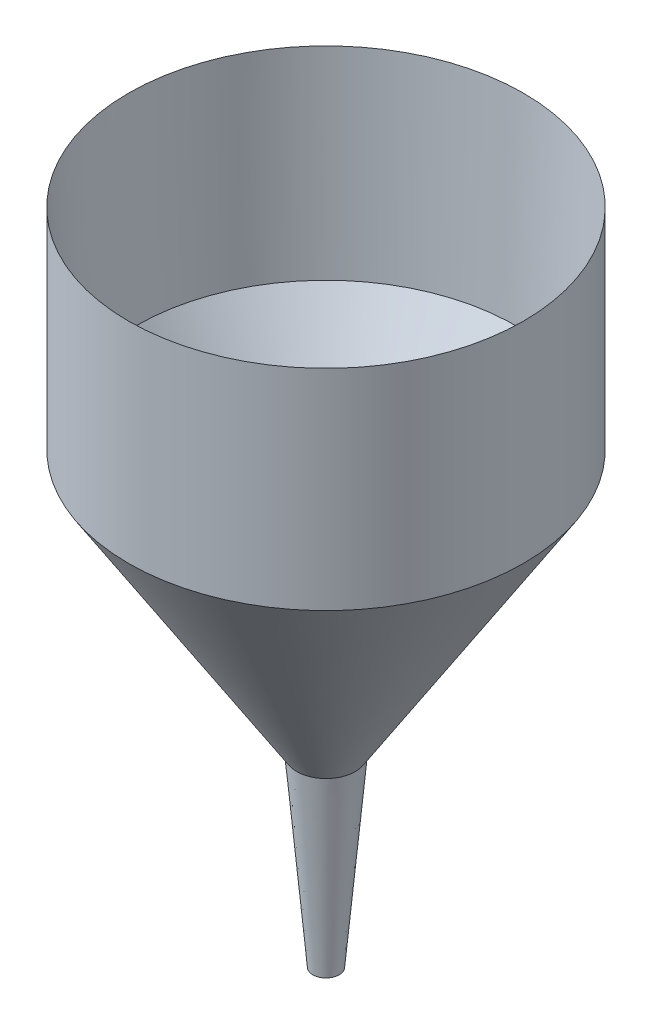
ISO-10303-21;
HEADER;
FILE_DESCRIPTION(('STEP AP214'),'2;1');
FILE_NAME('part.step','',(''),(''),'','','');
FILE_SCHEMA(('AUTOMOTIVE_DESIGN { 1 0 10303 214 1 1 1 1 }'));
ENDSEC;
DATA;
#1=APPLICATION_CONTEXT('core data for automotive mechanical design processes');
#2=APPLICATION_PROTOCOL_DEFINITION('international standard','automotive_design',2000,#1);
#3=PRODUCT_CONTEXT('',#1,'mechanical');
#4=PRODUCT('Part','Part','',(#3));
#5=PRODUCT_RELATED_PRODUCT_CATEGORY('part','',(#4));
#6=PRODUCT_DEFINITION_FORMATION('','',#4);
#7=PRODUCT_DEFINITION_CONTEXT('part definition',#1,'design');
#8=PRODUCT_DEFINITION('design','',#6,#7);
#9=PRODUCT_DEFINITION_SHAPE('','',#8);
#10=(LENGTH_UNIT() NAMED_UNIT(*) SI_UNIT(.MILLI.,.METRE.));
#11=(NAMED_UNIT(*) PLANE_ANGLE_UNIT() SI_UNIT($,.RADIAN.));
#12=(NAMED_UNIT(*) SI_UNIT($,.STERADIAN.) SOLID_ANGLE_UNIT());
#13=UNCERTAINTY_MEASURE_WITH_UNIT(LENGTH_MEASURE(1.E-05),#10,'distance_accuracy_value','');
#14=(GEOMETRIC_REPRESENTATION_CONTEXT(3) GLOBAL_UNCERTAINTY_ASSIGNED_CONTEXT((#13)) GLOBAL_UNIT_ASSIGNED_CONTEXT((#10,
#11,#12)) REPRESENTATION_CONTEXT('',''));
#15=CARTESIAN_POINT('',(0.,0.,0.));
#16=DIRECTION('',(0.,0.,1.));
#17=DIRECTION('',(1.,0.,0.));
#18=AXIS2_PLACEMENT_3D('',#15,#16,#17);
#19=CARTESIAN_POINT('',(0.,35.00020346889,0.));
#20=DIRECTION('',(0.,1.,0.));
#21=DIRECTION('',(-1.,0.,0.));
#22=AXIS2_PLACEMENT_3D('',#19,#20,#21);
#23=CONICAL_SURFACE('',#22,14.4106563891995,0.0392699081698657);
#24=CARTESIAN_POINT('',(0.,50.,0.));
#25=DIRECTION('',(0.,1.,0.));
#26=DIRECTION('',(-1.,0.,0.));
#27=AXIS2_PLACEMENT_3D('',#24,#25,#26);
#28=CIRCLE('',#27,15.);
#29=CARTESIAN_POINT('',(-15.,50.,0.));
#30=VERTEX_POINT('',#29);
#31=EDGE_CURVE('E53',#30,#30,#28,.T.);
#32=ORIENTED_EDGE('',*,*,#31,.T.);
#33=EDGE_LOOP('',(#32));
#34=FACE_BOUND('',#33,.T.);
#35=CARTESIAN_POINT('',(0.,35.00020346889,0.));
#36=DIRECTION('',(0.,1.,0.));
#37=DIRECTION('',(-1.,0.,0.));
#38=AXIS2_PLACEMENT_3D('',#35,#36,#37);
#39=CIRCLE('',#38,14.4106563891995);
#40=CARTESIAN_POINT('',(-14.4106563891995,35.00020346889,0.));
#41=VERTEX_POINT('',#40);
#42=EDGE_CURVE('E10',#41,#41,#39,.T.);
#43=ORIENTED_EDGE('',*,*,#42,.F.);
#44=EDGE_LOOP('',(#43));
#45=FACE_BOUND('',#44,.T.);
#46=ADVANCED_FACE('F31',(#34,#45),#23,.F.);
#47=CARTESIAN_POINT('',(0.,13.9218570853772,0.));
#48=DIRECTION('',(0.,1.,0.));
#49=DIRECTION('',(-1.,0.,0.));
#50=AXIS2_PLACEMENT_3D('',#47,#48,#49);
#51=CONICAL_SURFACE('',#50,0.999999999999994,0.566633421036452);
#52=CARTESIAN_POINT('',(0.,13.9218570853772,0.));
#53=DIRECTION('',(0.,1.,0.));
#54=DIRECTION('',(-1.,0.,0.));
#55=AXIS2_PLACEMENT_3D('',#52,#53,#54);
#56=CIRCLE('',#55,0.999999999999994);
#57=CARTESIAN_POINT('',(-0.999999999999993,13.9218570853772,0.));
#58=VERTEX_POINT('',#57);
#59=EDGE_CURVE('E37',#58,#58,#56,.T.);
#60=CARTESIAN_POINT('',(-14.4106563891995,35.00020346889,0.));
#61=CARTESIAN_POINT('',(-14.270962051812,34.7806373607284,0.));
#62=CARTESIAN_POINT('',(-14.1312677144245,34.5610712525669,0.));
#63=CARTESIAN_POINT('',(-13.8518790396495,34.1219390362437,0.));
#64=CARTESIAN_POINT('',(-13.712184702262,33.9023729280821,0.));
#65=CARTESIAN_POINT('',(-13.432796027487,33.4632407117589,0.));
#66=CARTESIAN_POINT('',(-13.2931016900996,33.2436746035973,0.));
#67=CARTESIAN_POINT('',(-13.0137130153246,32.8045423872741,0.));
#68=CARTESIAN_POINT('',(-12.8740186779371,32.5849762791125,0.));
#69=CARTESIAN_POINT('',(-12.5946300031621,32.1458440627893,0.));
#70=CARTESIAN_POINT('',(-12.4549356657746,31.9262779546278,0.));
#71=CARTESIAN_POINT('',(-12.1755469909996,31.4871457383046,0.));
#72=CARTESIAN_POINT('',(-12.0358526536121,31.267579630143,0.));
#73=CARTESIAN_POINT('',(-11.7564639788371,30.8284474138198,0.));
#74=CARTESIAN_POINT('',(-11.6167696414496,30.6088813056582,0.));
#75=CARTESIAN_POINT('',(-11.3373809666746,30.169749089335,0.));
#76=CARTESIAN_POINT('',(-11.1976866292871,29.9501829811734,0.));
#77=CARTESIAN_POINT('',(-10.9182979545121,29.5110507648502,0.));
#78=CARTESIAN_POINT('',(-10.7786036171246,29.2914846566887,0.));
#79=CARTESIAN_POINT('',(-10.4992149423497,28.8523524403655,0.));
#80=CARTESIAN_POINT('',(-10.3595206049622,28.6327863322039,0.));
#81=CARTESIAN_POINT('',(-10.0801319301872,28.1936541158807,0.));
#82=CARTESIAN_POINT('',(-9.94043759279968,27.9740880077191,0.));
#83=CARTESIAN_POINT('',(-9.66104891802469,27.5349557913959,0.));
#84=CARTESIAN_POINT('',(-9.52135458063719,27.3153896832343,0.));
#85=CARTESIAN_POINT('',(-9.2419659058622,26.8762574669111,0.));
#86=CARTESIAN_POINT('',(-9.10227156847471,26.6566913587496,0.));
#87=CARTESIAN_POINT('',(-8.82288289369972,26.2175591424264,0.));
#88=CARTESIAN_POINT('',(-8.68318855631222,25.9979930342648,0.));
#89=CARTESIAN_POINT('',(-8.40379988153723,25.5588608179416,0.));
#90=CARTESIAN_POINT('',(-8.26410554414973,25.33929470978,0.));
#91=CARTESIAN_POINT('',(-7.98471686937475,24.9001624934568,0.));
#92=CARTESIAN_POINT('',(-7.84502253198725,24.6805963852952,0.));
#93=CARTESIAN_POINT('',(-7.56563385721226,24.241464168972,0.));
#94=CARTESIAN_POINT('',(-7.42593951982476,24.0218980608105,0.));
#95=CARTESIAN_POINT('',(-7.14655084504977,23.5827658444873,0.));
#96=CARTESIAN_POINT('',(-7.00685650766228,23.3631997363257,0.));
#97=CARTESIAN_POINT('',(-6.72746783288729,22.9240675200025,0.));
#98=CARTESIAN_POINT('',(-6.58777349549979,22.7045014118409,0.));
#99=CARTESIAN_POINT('',(-6.3083848207248,22.2653691955177,0.));
#100=CARTESIAN_POINT('',(-6.16869048333731,22.0458030873561,0.));
#101=CARTESIAN_POINT('',(-5.88930180856232,21.606670871033,0.));
#102=CARTESIAN_POINT('',(-5.74960747117483,21.3871047628714,0.));
#103=CARTESIAN_POINT('',(-5.47021879639984,20.9479725465482,0.));
#104=CARTESIAN_POINT('',(-5.33052445901234,20.7284064383866,0.));
#105=CARTESIAN_POINT('',(-5.05113578423735,20.2892742220634,0.));
#106=CARTESIAN_POINT('',(-4.91144144684986,20.0697081139018,0.));
#107=CARTESIAN_POINT('',(-4.63205277207487,19.6305758975786,0.));
#108=CARTESIAN_POINT('',(-4.49235843468737,19.411009789417,0.));
#109=CARTESIAN_POINT('',(-4.21296975991238,18.9718775730939,0.));
#110=CARTESIAN_POINT('',(-4.07327542252489,18.7523114649323,0.));
#111=CARTESIAN_POINT('',(-3.7938867477499,18.3131792486091,0.));
#112=CARTESIAN_POINT('',(-3.6541924103624,18.0936131404475,0.));
#113=CARTESIAN_POINT('',(-3.37480373558741,17.6544809241243,0.));
#114=CARTESIAN_POINT('',(-3.23510939819992,17.4349148159627,0.));
#115=CARTESIAN_POINT('',(-2.95572072342492,16.9957825996395,0.));
#116=CARTESIAN_POINT('',(-2.81602638603743,16.7762164914779,0.));
#117=CARTESIAN_POINT('',(-2.53663771126244,16.3370842751548,0.));
#118=CARTESIAN_POINT('',(-2.39694337387494,16.1175181669932,0.));
#119=CARTESIAN_POINT('',(-2.11755469909995,15.67838595067,0.));
#120=CARTESIAN_POINT('',(-1.97786036171246,15.4588198425084,0.));
#121=CARTESIAN_POINT('',(-1.69847168693747,15.0196876261852,0.));
#122=CARTESIAN_POINT('',(-1.55877734954997,14.8001215180236,0.));
#123=CARTESIAN_POINT('',(-1.27938867477498,14.3609893017004,0.));
#124=CARTESIAN_POINT('',(-1.13969433738749,14.1414231935388,0.));
#125=CARTESIAN_POINT('',(-0.999999999999994,13.9218570853772,0.));
#126=B_SPLINE_CURVE_WITH_KNOTS('',3,(#60,#61,#62,#63,#64,#65,#66,#67,#68,#69,#70,#71,#72,#73,
#74,#75,#76,#77,#78,#79,#80,#81,#82,#83,#84,#85,#86,#87,#88,#89,#90,#91,#92,#93,#94,#95,#96,#97,
#98,#99,#100,#101,#102,#103,#104,#105,#106,#107,#108,#109,#110,#111,#112,#113,#114,#115,#116,
#117,#118,#119,#120,#121,#122,#123,#124,#125),.UNSPECIFIED.,.F.,.F.,(4,2,2,2,2,2,2,2,2,2,2,2,2,
2,2,2,2,2,2,2,2,2,2,2,2,2,2,2,2,2,2,2,4),(0.,0.780713810408293,1.56142762081658,
2.34214143122487,3.12285524163316,3.90356905204145,4.68428286244974,5.46499667285803,
6.24571048326632,7.02642429367461,7.8071381040829,8.58785191449119,9.36856572489948,
10.1492795353078,10.9299933457161,11.7107071561243,12.4914209665326,13.2721347769409,
14.0528485873492,14.8335623977575,15.6142762081658,16.3949900185741,17.1757038289824,
17.9564176393907,18.737131449799,19.5178452602072,20.2985590706155,21.0792728810238,
21.8599866914321,22.6407005018404,23.4214143122487,24.202128122657,24.9828419330653),.UNSPECIFIED.);
#127=EDGE_CURVE('BSEAM71',#41,#58,#126,.T.);
#128=ORIENTED_EDGE('',*,*,#42,.T.);
#129=ORIENTED_EDGE('',*,*,#59,.F.);
#130=ORIENTED_EDGE('',*,*,#127,.T.);
#131=ORIENTED_EDGE('',*,*,#127,.F.);
#132=EDGE_LOOP('',(#128,#130,#129,#131));
#133=FACE_BOUND('',#132,.T.);
#134=ADVANCED_FACE('F71',(#133),#51,.F.);
#135=CARTESIAN_POINT('',(0.,50.,0.));
#136=DIRECTION('',(0.,1.,0.));
#137=DIRECTION('',(-1.,0.,0.));
#138=AXIS2_PLACEMENT_3D('',#135,#136,#137);
#139=CYLINDRICAL_SURFACE('',#138,0.999999999999994);
#140=ORIENTED_EDGE('',*,*,#59,.T.);
#141=EDGE_LOOP('',(#140));
#142=FACE_BOUND('',#141,.T.);
#143=CARTESIAN_POINT('',(0.,0.,0.));
#144=DIRECTION('',(0.,1.,0.));
#145=DIRECTION('',(-1.,0.,0.));
#146=AXIS2_PLACEMENT_3D('',#143,#144,#145);
#147=CIRCLE('',#146,0.999999999999994);
#148=CARTESIAN_POINT('',(-0.999999999999994,0.,0.));
#149=VERTEX_POINT('',#148);
#150=EDGE_CURVE('E41',#149,#149,#147,.T.);
#151=ORIENTED_EDGE('',*,*,#150,.F.);
#152=EDGE_LOOP('',(#151));
#153=FACE_BOUND('',#152,.T.);
#154=ADVANCED_FACE('F75',(#142,#153),#139,.F.);
#155=CARTESIAN_POINT('',(0.,13.9815709150997,0.));
#156=DIRECTION('',(0.,1.,0.));
#157=DIRECTION('',(-1.,0.,0.));
#158=AXIS2_PLACEMENT_3D('',#155,#156,#157);
#159=CONICAL_SURFACE('',#158,2.22322895335491,0.0872664625997098);
#160=ORIENTED_EDGE('',*,*,#150,.T.);
#161=EDGE_LOOP('',(#160));
#162=FACE_BOUND('',#161,.T.);
#163=CARTESIAN_POINT('',(0.,13.9815709150997,0.));
#164=DIRECTION('',(0.,1.,0.));
#165=DIRECTION('',(-1.,0.,0.));
#166=AXIS2_PLACEMENT_3D('',#163,#164,#165);
#167=CIRCLE('',#166,2.22322895335491);
#168=CARTESIAN_POINT('',(-2.22322895335491,13.9815709150997,0.));
#169=VERTEX_POINT('',#168);
#170=EDGE_CURVE('E45',#169,#169,#167,.T.);
#171=ORIENTED_EDGE('',*,*,#170,.F.);
#172=EDGE_LOOP('',(#171));
#173=FACE_BOUND('',#172,.T.);
#174=ADVANCED_FACE('F67',(#162,#173),#159,.T.);
#175=CARTESIAN_POINT('',(0.,34.0636010535289,0.));
#176=DIRECTION('',(0.,1.,0.));
#177=DIRECTION('',(-1.,0.,0.));
#178=AXIS2_PLACEMENT_3D('',#175,#176,#177);
#179=CONICAL_SURFACE('',#178,15.,0.566633421036452);
#180=CARTESIAN_POINT('',(0.,34.0636010535289,0.));
#181=DIRECTION('',(0.,1.,0.));
#182=DIRECTION('',(-1.,0.,0.));
#183=AXIS2_PLACEMENT_3D('',#180,#181,#182);
#184=CIRCLE('',#183,15.);
#185=CARTESIAN_POINT('',(-15.,34.0636010535289,0.));
#186=VERTEX_POINT('',#185);
#187=EDGE_CURVE('E50',#186,#186,#184,.T.);
#188=CARTESIAN_POINT('',(-2.22322895335491,13.9815709150997,0.));
#189=CARTESIAN_POINT('',(-2.35632031842413,14.1907587290417,0.));
#190=CARTESIAN_POINT('',(-2.48941168349334,14.3999465429837,0.));
#191=CARTESIAN_POINT('',(-2.75559441363178,14.8183221708676,0.));
#192=CARTESIAN_POINT('',(-2.88868577870101,15.0275099848096,0.));
#193=CARTESIAN_POINT('',(-3.15486850883944,15.4458856126935,0.));
#194=CARTESIAN_POINT('',(-3.28795987390866,15.6550734266355,0.));
#195=CARTESIAN_POINT('',(-3.5541426040471,16.0734490545194,0.));
#196=CARTESIAN_POINT('',(-3.68723396911632,16.2826368684614,0.));
#197=CARTESIAN_POINT('',(-3.95341669925476,16.7010124963453,0.));
#198=CARTESIAN_POINT('',(-4.08650806432398,16.9102003102873,0.));
#199=CARTESIAN_POINT('',(-4.35269079446242,17.3285759381713,0.));
#200=CARTESIAN_POINT('',(-4.48578215953164,17.5377637521132,0.));
#201=CARTESIAN_POINT('',(-4.75196488967008,17.9561393799972,0.));
#202=CARTESIAN_POINT('',(-4.8850562547393,18.1653271939391,0.));
#203=CARTESIAN_POINT('',(-5.15123898487774,18.5837028218231,0.));
#204=CARTESIAN_POINT('',(-5.28433034994696,18.7928906357651,0.));
#205=CARTESIAN_POINT('',(-5.5505130800854,19.211266263649,0.));
#206=CARTESIAN_POINT('',(-5.68360444515462,19.420454077591,0.));
#207=CARTESIAN_POINT('',(-5.94978717529306,19.8388297054749,0.));
#208=CARTESIAN_POINT('',(-6.08287854036228,20.0480175194169,0.));
#209=CARTESIAN_POINT('',(-6.34906127050072,20.4663931473008,0.));
#210=CARTESIAN_POINT('',(-6.48215263556994,20.6755809612428,0.));
#211=CARTESIAN_POINT('',(-6.74833536570838,21.0939565891267,0.));
#212=CARTESIAN_POINT('',(-6.8814267307776,21.3031444030687,0.));
#213=CARTESIAN_POINT('',(-7.14760946091603,21.7215200309526,0.));
#214=CARTESIAN_POINT('',(-7.28070082598525,21.9307078448946,0.));
#215=CARTESIAN_POINT('',(-7.54688355612369,22.3490834727786,0.));
#216=CARTESIAN_POINT('',(-7.67997492119291,22.5582712867205,0.));
#217=CARTESIAN_POINT('',(-7.94615765133135,22.9766469146045,0.));
#218=CARTESIAN_POINT('',(-8.07924901640057,23.1858347285464,0.));
#219=CARTESIAN_POINT('',(-8.34543174653901,23.6042103564304,0.));
#220=CARTESIAN_POINT('',(-8.47852311160823,23.8133981703723,0.));
#221=CARTESIAN_POINT('',(-8.74470584174667,24.2317737982563,0.));
#222=CARTESIAN_POINT('',(-8.87779720681589,24.4409616121983,0.));
#223=CARTESIAN_POINT('',(-9.14397993695433,24.8593372400822,0.));
#224=CARTESIAN_POINT('',(-9.27707130202355,25.0685250540242,0.));
#225=CARTESIAN_POINT('',(-9.54325403216199,25.4869006819081,0.));
#226=CARTESIAN_POINT('',(-9.67634539723121,25.6960884958501,0.));
#227=CARTESIAN_POINT('',(-9.94252812736965,26.114464123734,0.));
#228=CARTESIAN_POINT('',(-10.0756194924389,26.323651937676,0.));
#229=CARTESIAN_POINT('',(-10.3418022225773,26.7420275655599,0.));
#230=CARTESIAN_POINT('',(-10.4748935876465,26.9512153795019,0.));
#231=CARTESIAN_POINT('',(-10.741076317785,27.3695910073858,0.));
#232=CARTESIAN_POINT('',(-10.8741676828542,27.5787788213278,0.));
#233=CARTESIAN_POINT('',(-11.1403504129926,27.9971544492118,0.));
#234=CARTESIAN_POINT('',(-11.2734417780618,28.2063422631537,0.));
#235=CARTESIAN_POINT('',(-11.5396245082003,28.6247178910377,0.));
#236=CARTESIAN_POINT('',(-11.6727158732695,28.8339057049796,0.));
#237=CARTESIAN_POINT('',(-11.9388986034079,29.2522813328636,0.));
#238=CARTESIAN_POINT('',(-12.0719899684772,29.4614691468055,0.));
#239=CARTESIAN_POINT('',(-12.3381726986156,29.8798447746895,0.));
#240=CARTESIAN_POINT('',(-12.4712640636848,30.0890325886315,0.));
#241=CARTESIAN_POINT('',(-12.7374467938233,30.5074082165154,0.));
#242=CARTESIAN_POINT('',(-12.8705381588925,30.7165960304574,0.));
#243=CARTESIAN_POINT('',(-13.1367208890309,31.1349716583413,0.));
#244=CARTESIAN_POINT('',(-13.2698122541001,31.3441594722833,0.));
#245=CARTESIAN_POINT('',(-13.5359949842386,31.7625351001672,0.));
#246=CARTESIAN_POINT('',(-13.6690863493078,31.9717229141092,0.));
#247=CARTESIAN_POINT('',(-13.9352690794462,32.3900985419931,0.));
#248=CARTESIAN_POINT('',(-14.0683604445155,32.5992863559351,0.));
#249=CARTESIAN_POINT('',(-14.3345431746539,33.017661983819,0.));
#250=CARTESIAN_POINT('',(-14.4676345397231,33.226849797761,0.));
#251=CARTESIAN_POINT('',(-14.7338172698616,33.645225425645,0.));
#252=CARTESIAN_POINT('',(-14.8669086349308,33.8544132395869,0.));
#253=CARTESIAN_POINT('',(-15.,34.0636010535289,0.));
#254=B_SPLINE_CURVE_WITH_KNOTS('',3,(#188,#189,#190,#191,#192,#193,#194,#195,#196,#197,#198,
#199,#200,#201,#202,#203,#204,#205,#206,#207,#208,#209,#210,#211,#212,#213,#214,#215,#216,#217,
#218,#219,#220,#221,#222,#223,#224,#225,#226,#227,#228,#229,#230,#231,#232,#233,#234,#235,#236,
#237,#238,#239,#240,#241,#242,#243,#244,#245,#246,#247,#248,#249,#250,#251,#252,#253),
.UNSPECIFIED.,.F.,.F.,(4,2,2,2,2,2,2,2,2,2,2,2,2,2,2,2,2,2,2,2,2,2,2,2,2,2,2,2,2,2,2,2,4),(0.,
0.743811586774686,1.48762317354938,2.23143476032406,2.97524634709875,3.71905793387344,
4.46286952064813,5.20668110742282,5.9504926941975,6.69430428097219,7.43811586774688,
8.18192745452157,8.92573904129625,9.66955062807094,10.4133622148456,11.1571738016203,
11.900985388395,12.6447969751697,13.3886085619444,14.1324201487191,14.8762317354938,
15.6200433222684,16.3638549090431,17.1076664958178,17.8514780825925,18.5952896693672,
19.3391012561419,20.0829128429166,20.8267244296913,21.5705360164659,22.3143476032406,
23.0581591900153,23.80197077679),.UNSPECIFIED.);
#255=EDGE_CURVE('BSEAM61',#169,#186,#254,.T.);
#256=ORIENTED_EDGE('',*,*,#170,.T.);
#257=ORIENTED_EDGE('',*,*,#187,.F.);
#258=ORIENTED_EDGE('',*,*,#255,.T.);
#259=ORIENTED_EDGE('',*,*,#255,.F.);
#260=EDGE_LOOP('',(#256,#258,#257,#259));
#261=FACE_BOUND('',#260,.T.);
#262=ADVANCED_FACE('F61',(#261),#179,.T.);
#263=CARTESIAN_POINT('',(0.,50.,0.));
#264=DIRECTION('',(0.,1.,0.));
#265=DIRECTION('',(-1.,0.,0.));
#266=AXIS2_PLACEMENT_3D('',#263,#264,#265);
#267=CYLINDRICAL_SURFACE('',#266,15.);
#268=ORIENTED_EDGE('',*,*,#187,.T.);
#269=EDGE_LOOP('',(#268));
#270=FACE_BOUND('',#269,.T.);
#271=ORIENTED_EDGE('',*,*,#31,.F.);
#272=EDGE_LOOP('',(#271));
#273=FACE_BOUND('',#272,.T.);
#274=ADVANCED_FACE('F59',(#270,#273),#267,.T.);
#275=CLOSED_SHELL('',(#46,#134,#154,#174,#262,#274));
#276=MANIFOLD_SOLID_BREP('B2',#275);
#277=ADVANCED_BREP_SHAPE_REPRESENTATION('',(#18,#276),#14);
#278=SHAPE_DEFINITION_REPRESENTATION(#9,#277);
ENDSEC;
END-ISO-10303-21;
